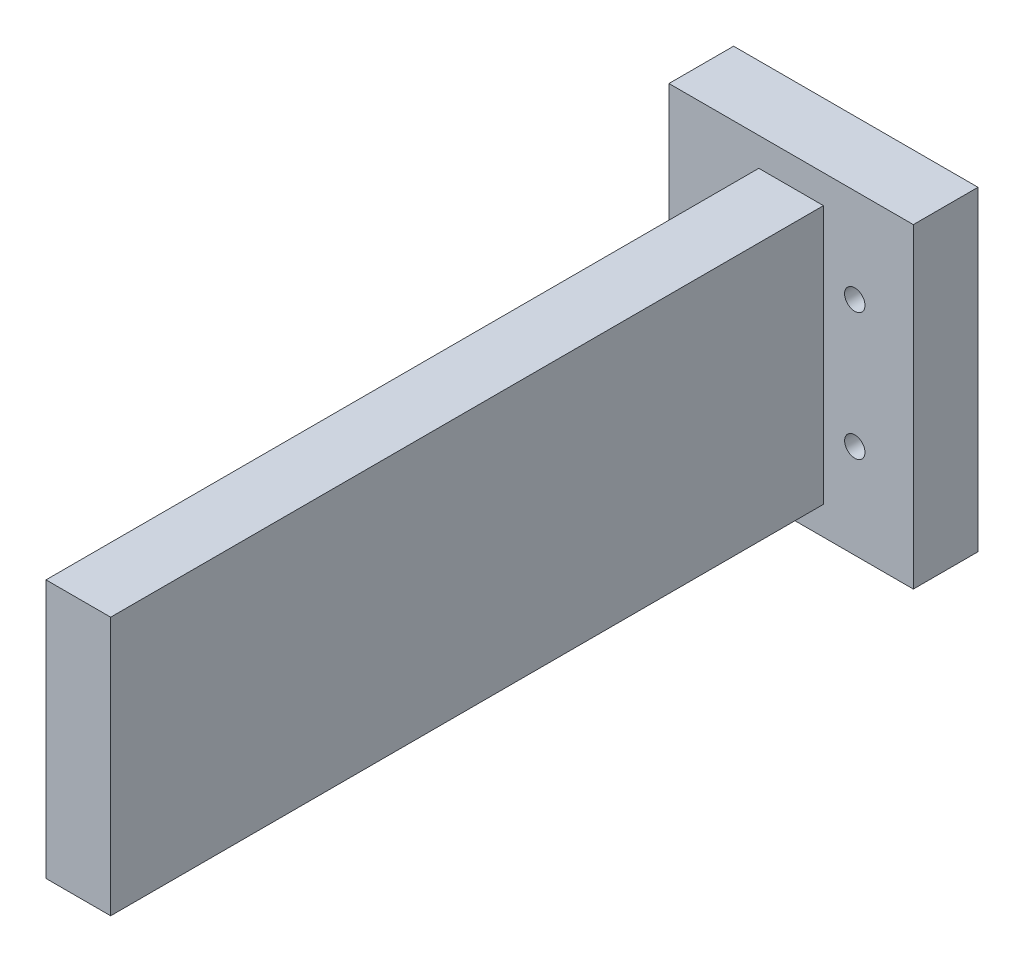
ISO-10303-21;
HEADER;
FILE_DESCRIPTION(('STEP AP214'),'2;1');
FILE_NAME('part.step','',(''),(''),'','','');
FILE_SCHEMA(('AUTOMOTIVE_DESIGN { 1 0 10303 214 1 1 1 1 }'));
ENDSEC;
DATA;
#1=APPLICATION_CONTEXT('core data for automotive mechanical design processes');
#2=APPLICATION_PROTOCOL_DEFINITION('international standard','automotive_design',2000,#1);
#3=PRODUCT_CONTEXT('',#1,'mechanical');
#4=PRODUCT('Part','Part','',(#3));
#5=PRODUCT_RELATED_PRODUCT_CATEGORY('part','',(#4));
#6=PRODUCT_DEFINITION_FORMATION('','',#4);
#7=PRODUCT_DEFINITION_CONTEXT('part definition',#1,'design');
#8=PRODUCT_DEFINITION('design','',#6,#7);
#9=PRODUCT_DEFINITION_SHAPE('','',#8);
#10=(LENGTH_UNIT() NAMED_UNIT(*) SI_UNIT(.MILLI.,.METRE.));
#11=(NAMED_UNIT(*) PLANE_ANGLE_UNIT() SI_UNIT($,.RADIAN.));
#12=(NAMED_UNIT(*) SI_UNIT($,.STERADIAN.) SOLID_ANGLE_UNIT());
#13=UNCERTAINTY_MEASURE_WITH_UNIT(LENGTH_MEASURE(1.E-05),#10,'distance_accuracy_value','');
#14=(GEOMETRIC_REPRESENTATION_CONTEXT(3) GLOBAL_UNCERTAINTY_ASSIGNED_CONTEXT((#13)) GLOBAL_UNIT_ASSIGNED_CONTEXT((#10,
#11,#12)) REPRESENTATION_CONTEXT('',''));
#15=CARTESIAN_POINT('',(0.,0.,0.));
#16=DIRECTION('',(0.,0.,1.));
#17=DIRECTION('',(1.,0.,0.));
#18=AXIS2_PLACEMENT_3D('',#15,#16,#17);
#19=CARTESIAN_POINT('',(0.,0.,12.7));
#20=DIRECTION('',(0.,0.,1.));
#21=DIRECTION('',(1.,0.,0.));
#22=AXIS2_PLACEMENT_3D('',#19,#20,#21);
#23=PLANE('',#22);
#24=CARTESIAN_POINT('',(-12.5,-12.5,12.7));
#25=DIRECTION('',(0.,0.,1.));
#26=DIRECTION('',(1.,0.,0.));
#27=AXIS2_PLACEMENT_3D('',#24,#25,#26);
#28=CIRCLE('',#27,2.01011648454401);
#29=CARTESIAN_POINT('',(-10.489883515456,-12.5,12.7));
#30=VERTEX_POINT('',#29);
#31=EDGE_CURVE('E143',#30,#30,#28,.T.);
#32=ORIENTED_EDGE('',*,*,#31,.F.);
#33=EDGE_LOOP('',(#32));
#34=FACE_BOUND('',#33,.T.);
#35=CARTESIAN_POINT('',(-12.5,12.5,12.7));
#36=DIRECTION('',(0.,0.,1.));
#37=DIRECTION('',(1.,0.,0.));
#38=AXIS2_PLACEMENT_3D('',#35,#36,#37);
#39=CIRCLE('',#38,1.99696048457677);
#40=CARTESIAN_POINT('',(-10.5030395154232,12.5,12.7));
#41=VERTEX_POINT('',#40);
#42=EDGE_CURVE('E155',#41,#41,#39,.T.);
#43=ORIENTED_EDGE('',*,*,#42,.F.);
#44=EDGE_LOOP('',(#43));
#45=FACE_BOUND('',#44,.T.);
#46=DIRECTION('',(0.,-1.,0.));
#47=VECTOR('',#46,1.);
#48=CARTESIAN_POINT('',(-24.,-31.,12.7));
#49=LINE('',#48,#47);
#50=CARTESIAN_POINT('',(-24.,31.,12.7));
#51=VERTEX_POINT('',#50);
#52=CARTESIAN_POINT('',(-24.,-31.,12.7));
#53=VERTEX_POINT('',#52);
#54=EDGE_CURVE('E161',#51,#53,#49,.T.);
#55=ORIENTED_EDGE('',*,*,#54,.T.);
#56=DIRECTION('',(1.,0.,0.));
#57=VECTOR('',#56,1.);
#58=CARTESIAN_POINT('',(24.,-31.,12.7));
#59=LINE('',#58,#57);
#60=CARTESIAN_POINT('',(24.,-31.,12.7));
#61=VERTEX_POINT('',#60);
#62=EDGE_CURVE('E85',#53,#61,#59,.T.);
#63=ORIENTED_EDGE('',*,*,#62,.T.);
#64=DIRECTION('',(0.,1.,0.));
#65=VECTOR('',#64,1.);
#66=CARTESIAN_POINT('',(24.,-31.,12.7));
#67=LINE('',#66,#65);
#68=CARTESIAN_POINT('',(24.,31.,12.7));
#69=VERTEX_POINT('',#68);
#70=EDGE_CURVE('E164',#61,#69,#67,.T.);
#71=ORIENTED_EDGE('',*,*,#70,.T.);
#72=DIRECTION('',(-1.,0.,0.));
#73=VECTOR('',#72,1.);
#74=CARTESIAN_POINT('',(24.,31.,12.7));
#75=LINE('',#74,#73);
#76=EDGE_CURVE('E57',#69,#51,#75,.T.);
#77=ORIENTED_EDGE('',*,*,#76,.T.);
#78=EDGE_LOOP('',(#55,#63,#71,#77));
#79=FACE_BOUND('',#78,.T.);
#80=CARTESIAN_POINT('',(12.5,12.5,12.7));
#81=DIRECTION('',(0.,0.,1.));
#82=DIRECTION('',(1.,0.,0.));
#83=AXIS2_PLACEMENT_3D('',#80,#81,#82);
#84=CIRCLE('',#83,2.00300446249013);
#85=CARTESIAN_POINT('',(14.5030044624901,12.5,12.7));
#86=VERTEX_POINT('',#85);
#87=EDGE_CURVE('E149',#86,#86,#84,.T.);
#88=ORIENTED_EDGE('',*,*,#87,.F.);
#89=EDGE_LOOP('',(#88));
#90=FACE_BOUND('',#89,.T.);
#91=CARTESIAN_POINT('',(12.5,-12.5,12.7));
#92=DIRECTION('',(0.,0.,1.));
#93=DIRECTION('',(1.,0.,0.));
#94=AXIS2_PLACEMENT_3D('',#91,#92,#93);
#95=CIRCLE('',#94,1.99512323308478);
#96=CARTESIAN_POINT('',(14.4951232330848,-12.5,12.7));
#97=VERTEX_POINT('',#96);
#98=EDGE_CURVE('E135',#97,#97,#95,.T.);
#99=ORIENTED_EDGE('',*,*,#98,.F.);
#100=EDGE_LOOP('',(#99));
#101=FACE_BOUND('',#100,.T.);
#102=DIRECTION('',(1.,0.,0.));
#103=VECTOR('',#102,1.);
#104=CARTESIAN_POINT('',(6.35,-25.4,12.7));
#105=LINE('',#104,#103);
#106=CARTESIAN_POINT('',(-6.35,-25.4,12.7));
#107=VERTEX_POINT('',#106);
#108=CARTESIAN_POINT('',(6.35,-25.4,12.7));
#109=VERTEX_POINT('',#108);
#110=EDGE_CURVE('E331',#107,#109,#105,.T.);
#111=ORIENTED_EDGE('',*,*,#110,.F.);
#112=DIRECTION('',(0.,-1.,0.));
#113=VECTOR('',#112,1.);
#114=CARTESIAN_POINT('',(-6.35,-25.4,12.7));
#115=LINE('',#114,#113);
#116=CARTESIAN_POINT('',(-6.35,25.4,12.7));
#117=VERTEX_POINT('',#116);
#118=EDGE_CURVE('E130',#117,#107,#115,.T.);
#119=ORIENTED_EDGE('',*,*,#118,.F.);
#120=DIRECTION('',(-1.,0.,0.));
#121=VECTOR('',#120,1.);
#122=CARTESIAN_POINT('',(6.35,25.4,12.7));
#123=LINE('',#122,#121);
#124=CARTESIAN_POINT('',(6.35,25.4,12.7));
#125=VERTEX_POINT('',#124);
#126=EDGE_CURVE('E126',#125,#117,#123,.T.);
#127=ORIENTED_EDGE('',*,*,#126,.F.);
#128=DIRECTION('',(0.,1.,0.));
#129=VECTOR('',#128,1.);
#130=CARTESIAN_POINT('',(6.35,-25.4,12.7));
#131=LINE('',#130,#129);
#132=EDGE_CURVE('E328',#109,#125,#131,.T.);
#133=ORIENTED_EDGE('',*,*,#132,.F.);
#134=EDGE_LOOP('',(#111,#119,#127,#133));
#135=FACE_BOUND('',#134,.T.);
#136=ADVANCED_FACE('F33',(#34,#45,#79,#90,#101,#135),#23,.T.);
#137=CARTESIAN_POINT('',(0.,0.,0.));
#138=DIRECTION('',(0.,0.,1.));
#139=DIRECTION('',(1.,0.,0.));
#140=AXIS2_PLACEMENT_3D('',#137,#138,#139);
#141=PLANE('',#140);
#142=DIRECTION('',(0.,-1.,0.));
#143=VECTOR('',#142,1.);
#144=CARTESIAN_POINT('',(-24.,-31.,0.));
#145=LINE('',#144,#143);
#146=CARTESIAN_POINT('',(-24.,31.,0.));
#147=VERTEX_POINT('',#146);
#148=CARTESIAN_POINT('',(-24.,-31.,0.));
#149=VERTEX_POINT('',#148);
#150=EDGE_CURVE('E158',#147,#149,#145,.T.);
#151=ORIENTED_EDGE('',*,*,#150,.F.);
#152=DIRECTION('',(-1.,0.,0.));
#153=VECTOR('',#152,1.);
#154=CARTESIAN_POINT('',(24.,31.,0.));
#155=LINE('',#154,#153);
#156=CARTESIAN_POINT('',(24.,31.,0.));
#157=VERTEX_POINT('',#156);
#158=EDGE_CURVE('E78',#157,#147,#155,.T.);
#159=ORIENTED_EDGE('',*,*,#158,.F.);
#160=DIRECTION('',(0.,1.,0.));
#161=VECTOR('',#160,1.);
#162=CARTESIAN_POINT('',(24.,-31.,0.));
#163=LINE('',#162,#161);
#164=CARTESIAN_POINT('',(24.,-31.,0.));
#165=VERTEX_POINT('',#164);
#166=EDGE_CURVE('E172',#165,#157,#163,.T.);
#167=ORIENTED_EDGE('',*,*,#166,.F.);
#168=DIRECTION('',(1.,0.,0.));
#169=VECTOR('',#168,1.);
#170=CARTESIAN_POINT('',(24.,-31.,0.));
#171=LINE('',#170,#169);
#172=EDGE_CURVE('E170',#149,#165,#171,.T.);
#173=ORIENTED_EDGE('',*,*,#172,.F.);
#174=EDGE_LOOP('',(#151,#159,#167,#173));
#175=FACE_BOUND('',#174,.T.);
#176=CARTESIAN_POINT('',(-12.5,12.5,0.));
#177=DIRECTION('',(0.,0.,1.));
#178=DIRECTION('',(1.,0.,0.));
#179=AXIS2_PLACEMENT_3D('',#176,#177,#178);
#180=CIRCLE('',#179,1.99696048457677);
#181=CARTESIAN_POINT('',(-10.5030395154232,12.5,0.));
#182=VERTEX_POINT('',#181);
#183=EDGE_CURVE('E152',#182,#182,#180,.T.);
#184=ORIENTED_EDGE('',*,*,#183,.T.);
#185=EDGE_LOOP('',(#184));
#186=FACE_BOUND('',#185,.T.);
#187=CARTESIAN_POINT('',(12.5,12.5,0.));
#188=DIRECTION('',(0.,0.,1.));
#189=DIRECTION('',(1.,0.,0.));
#190=AXIS2_PLACEMENT_3D('',#187,#188,#189);
#191=CIRCLE('',#190,2.00300446249013);
#192=CARTESIAN_POINT('',(14.5030044624901,12.5,0.));
#193=VERTEX_POINT('',#192);
#194=EDGE_CURVE('E146',#193,#193,#191,.T.);
#195=ORIENTED_EDGE('',*,*,#194,.T.);
#196=EDGE_LOOP('',(#195));
#197=FACE_BOUND('',#196,.T.);
#198=CARTESIAN_POINT('',(-12.5,-12.5,0.));
#199=DIRECTION('',(0.,0.,1.));
#200=DIRECTION('',(1.,0.,0.));
#201=AXIS2_PLACEMENT_3D('',#198,#199,#200);
#202=CIRCLE('',#201,2.01011648454401);
#203=CARTESIAN_POINT('',(-10.489883515456,-12.5,0.));
#204=VERTEX_POINT('',#203);
#205=EDGE_CURVE('E141',#204,#204,#202,.T.);
#206=ORIENTED_EDGE('',*,*,#205,.T.);
#207=EDGE_LOOP('',(#206));
#208=FACE_BOUND('',#207,.T.);
#209=CARTESIAN_POINT('',(12.5,-12.5,0.));
#210=DIRECTION('',(0.,0.,1.));
#211=DIRECTION('',(1.,0.,0.));
#212=AXIS2_PLACEMENT_3D('',#209,#210,#211);
#213=CIRCLE('',#212,1.99512323308478);
#214=CARTESIAN_POINT('',(14.4951232330848,-12.5,0.));
#215=VERTEX_POINT('',#214);
#216=EDGE_CURVE('E132',#215,#215,#213,.T.);
#217=ORIENTED_EDGE('',*,*,#216,.T.);
#218=EDGE_LOOP('',(#217));
#219=FACE_BOUND('',#218,.T.);
#220=ADVANCED_FACE('F185',(#175,#186,#197,#208,#219),#141,.F.);
#221=CARTESIAN_POINT('',(-24.,-31.,12.7));
#222=DIRECTION('',(1.,0.,0.));
#223=DIRECTION('',(0.,0.,-1.));
#224=AXIS2_PLACEMENT_3D('',#221,#222,#223);
#225=PLANE('',#224);
#226=ORIENTED_EDGE('',*,*,#150,.T.);
#227=DIRECTION('',(0.,0.,-1.));
#228=VECTOR('',#227,1.);
#229=CARTESIAN_POINT('',(-24.,-31.,12.7));
#230=LINE('',#229,#228);
#231=EDGE_CURVE('E11',#53,#149,#230,.T.);
#232=ORIENTED_EDGE('',*,*,#231,.F.);
#233=ORIENTED_EDGE('',*,*,#54,.F.);
#234=DIRECTION('',(0.,0.,-1.));
#235=VECTOR('',#234,1.);
#236=CARTESIAN_POINT('',(-24.,31.,12.7));
#237=LINE('',#236,#235);
#238=EDGE_CURVE('E167',#51,#147,#237,.T.);
#239=ORIENTED_EDGE('',*,*,#238,.T.);
#240=EDGE_LOOP('',(#226,#232,#233,#239));
#241=FACE_BOUND('',#240,.T.);
#242=ADVANCED_FACE('F35',(#241),#225,.F.);
#243=CARTESIAN_POINT('',(24.,-31.,12.7));
#244=DIRECTION('',(0.,1.,0.));
#245=DIRECTION('',(-1.,0.,0.));
#246=AXIS2_PLACEMENT_3D('',#243,#244,#245);
#247=PLANE('',#246);
#248=ORIENTED_EDGE('',*,*,#172,.T.);
#249=DIRECTION('',(0.,0.,-1.));
#250=VECTOR('',#249,1.);
#251=CARTESIAN_POINT('',(24.,-31.,12.7));
#252=LINE('',#251,#250);
#253=EDGE_CURVE('E41',#61,#165,#252,.T.);
#254=ORIENTED_EDGE('',*,*,#253,.F.);
#255=ORIENTED_EDGE('',*,*,#62,.F.);
#256=ORIENTED_EDGE('',*,*,#231,.T.);
#257=EDGE_LOOP('',(#248,#254,#255,#256));
#258=FACE_BOUND('',#257,.T.);
#259=ADVANCED_FACE('F201',(#258),#247,.F.);
#260=CARTESIAN_POINT('',(24.,-31.,12.7));
#261=DIRECTION('',(-1.,0.,0.));
#262=DIRECTION('',(0.,0.,1.));
#263=AXIS2_PLACEMENT_3D('',#260,#261,#262);
#264=PLANE('',#263);
#265=ORIENTED_EDGE('',*,*,#166,.T.);
#266=DIRECTION('',(0.,0.,-1.));
#267=VECTOR('',#266,1.);
#268=CARTESIAN_POINT('',(24.,31.,12.7));
#269=LINE('',#268,#267);
#270=EDGE_CURVE('E176',#69,#157,#269,.T.);
#271=ORIENTED_EDGE('',*,*,#270,.F.);
#272=ORIENTED_EDGE('',*,*,#70,.F.);
#273=ORIENTED_EDGE('',*,*,#253,.T.);
#274=EDGE_LOOP('',(#265,#271,#272,#273));
#275=FACE_BOUND('',#274,.T.);
#276=ADVANCED_FACE('F181',(#275),#264,.F.);
#277=CARTESIAN_POINT('',(24.,31.,12.7));
#278=DIRECTION('',(0.,-1.,0.));
#279=DIRECTION('',(1.,0.,0.));
#280=AXIS2_PLACEMENT_3D('',#277,#278,#279);
#281=PLANE('',#280);
#282=ORIENTED_EDGE('',*,*,#158,.T.);
#283=ORIENTED_EDGE('',*,*,#238,.F.);
#284=ORIENTED_EDGE('',*,*,#76,.F.);
#285=ORIENTED_EDGE('',*,*,#270,.T.);
#286=EDGE_LOOP('',(#282,#283,#284,#285));
#287=FACE_BOUND('',#286,.T.);
#288=ADVANCED_FACE('F190',(#287),#281,.F.);
#289=CARTESIAN_POINT('',(-12.5,12.5,12.7));
#290=DIRECTION('',(0.,0.,-1.));
#291=DIRECTION('',(-1.,0.,0.));
#292=AXIS2_PLACEMENT_3D('',#289,#290,#291);
#293=CYLINDRICAL_SURFACE('',#292,1.99696048457677);
#294=ORIENTED_EDGE('',*,*,#42,.T.);
#295=EDGE_LOOP('',(#294));
#296=FACE_BOUND('',#295,.T.);
#297=ORIENTED_EDGE('',*,*,#183,.F.);
#298=EDGE_LOOP('',(#297));
#299=FACE_BOUND('',#298,.T.);
#300=ADVANCED_FACE('F192',(#296,#299),#293,.F.);
#301=CARTESIAN_POINT('',(12.5,12.5,12.7));
#302=DIRECTION('',(0.,0.,-1.));
#303=DIRECTION('',(-1.,0.,0.));
#304=AXIS2_PLACEMENT_3D('',#301,#302,#303);
#305=CYLINDRICAL_SURFACE('',#304,2.00300446249013);
#306=ORIENTED_EDGE('',*,*,#87,.T.);
#307=EDGE_LOOP('',(#306));
#308=FACE_BOUND('',#307,.T.);
#309=ORIENTED_EDGE('',*,*,#194,.F.);
#310=EDGE_LOOP('',(#309));
#311=FACE_BOUND('',#310,.T.);
#312=ADVANCED_FACE('F198',(#308,#311),#305,.F.);
#313=CARTESIAN_POINT('',(-12.5,-12.5,12.7));
#314=DIRECTION('',(0.,0.,-1.));
#315=DIRECTION('',(-1.,0.,0.));
#316=AXIS2_PLACEMENT_3D('',#313,#314,#315);
#317=CYLINDRICAL_SURFACE('',#316,2.01011648454401);
#318=ORIENTED_EDGE('',*,*,#31,.T.);
#319=EDGE_LOOP('',(#318));
#320=FACE_BOUND('',#319,.T.);
#321=ORIENTED_EDGE('',*,*,#205,.F.);
#322=EDGE_LOOP('',(#321));
#323=FACE_BOUND('',#322,.T.);
#324=ADVANCED_FACE('F215',(#320,#323),#317,.F.);
#325=CARTESIAN_POINT('',(12.5,-12.5,12.7));
#326=DIRECTION('',(0.,0.,-1.));
#327=DIRECTION('',(-1.,0.,0.));
#328=AXIS2_PLACEMENT_3D('',#325,#326,#327);
#329=CYLINDRICAL_SURFACE('',#328,1.99512323308478);
#330=ORIENTED_EDGE('',*,*,#98,.T.);
#331=EDGE_LOOP('',(#330));
#332=FACE_BOUND('',#331,.T.);
#333=ORIENTED_EDGE('',*,*,#216,.F.);
#334=EDGE_LOOP('',(#333));
#335=FACE_BOUND('',#334,.T.);
#336=ADVANCED_FACE('F219',(#332,#335),#329,.F.);
#337=CARTESIAN_POINT('',(-6.35,-25.4,152.7));
#338=DIRECTION('',(1.,0.,0.));
#339=DIRECTION('',(0.,0.,-1.));
#340=AXIS2_PLACEMENT_3D('',#337,#338,#339);
#341=PLANE('',#340);
#342=ORIENTED_EDGE('',*,*,#118,.T.);
#343=DIRECTION('',(0.,0.,-1.));
#344=VECTOR('',#343,1.);
#345=CARTESIAN_POINT('',(-6.35,-25.4,152.7));
#346=LINE('',#345,#344);
#347=CARTESIAN_POINT('',(-6.35,-25.4,152.7));
#348=VERTEX_POINT('',#347);
#349=EDGE_CURVE('E111',#348,#107,#346,.T.);
#350=ORIENTED_EDGE('',*,*,#349,.F.);
#351=DIRECTION('',(0.,-1.,0.));
#352=VECTOR('',#351,1.);
#353=CARTESIAN_POINT('',(-6.35,-25.4,152.7));
#354=LINE('',#353,#352);
#355=CARTESIAN_POINT('',(-6.35,25.4,152.7));
#356=VERTEX_POINT('',#355);
#357=EDGE_CURVE('E118',#356,#348,#354,.T.);
#358=ORIENTED_EDGE('',*,*,#357,.F.);
#359=DIRECTION('',(0.,0.,-1.));
#360=VECTOR('',#359,1.);
#361=CARTESIAN_POINT('',(-6.35,25.4,152.7));
#362=LINE('',#361,#360);
#363=EDGE_CURVE('E325',#356,#117,#362,.T.);
#364=ORIENTED_EDGE('',*,*,#363,.T.);
#365=EDGE_LOOP('',(#342,#350,#358,#364));
#366=FACE_BOUND('',#365,.T.);
#367=ADVANCED_FACE('F128',(#366),#341,.F.);
#368=CARTESIAN_POINT('',(6.35,-25.4,152.7));
#369=DIRECTION('',(0.,1.,0.));
#370=DIRECTION('',(0.,0.,1.));
#371=AXIS2_PLACEMENT_3D('',#368,#369,#370);
#372=PLANE('',#371);
#373=ORIENTED_EDGE('',*,*,#110,.T.);
#374=DIRECTION('',(0.,0.,-1.));
#375=VECTOR('',#374,1.);
#376=CARTESIAN_POINT('',(6.35,-25.4,152.7));
#377=LINE('',#376,#375);
#378=CARTESIAN_POINT('',(6.35,-25.4,152.7));
#379=VERTEX_POINT('',#378);
#380=EDGE_CURVE('E114',#379,#109,#377,.T.);
#381=ORIENTED_EDGE('',*,*,#380,.F.);
#382=DIRECTION('',(1.,0.,0.));
#383=VECTOR('',#382,1.);
#384=CARTESIAN_POINT('',(6.35,-25.4,152.7));
#385=LINE('',#384,#383);
#386=EDGE_CURVE('E107',#348,#379,#385,.T.);
#387=ORIENTED_EDGE('',*,*,#386,.F.);
#388=ORIENTED_EDGE('',*,*,#349,.T.);
#389=EDGE_LOOP('',(#373,#381,#387,#388));
#390=FACE_BOUND('',#389,.T.);
#391=ADVANCED_FACE('F109',(#390),#372,.F.);
#392=CARTESIAN_POINT('',(6.35,-25.4,152.7));
#393=DIRECTION('',(-1.,0.,0.));
#394=DIRECTION('',(0.,0.,1.));
#395=AXIS2_PLACEMENT_3D('',#392,#393,#394);
#396=PLANE('',#395);
#397=ORIENTED_EDGE('',*,*,#132,.T.);
#398=DIRECTION('',(0.,0.,-1.));
#399=VECTOR('',#398,1.);
#400=CARTESIAN_POINT('',(6.35,25.4,152.7));
#401=LINE('',#400,#399);
#402=CARTESIAN_POINT('',(6.35,25.4,152.7));
#403=VERTEX_POINT('',#402);
#404=EDGE_CURVE('E48',#403,#125,#401,.T.);
#405=ORIENTED_EDGE('',*,*,#404,.F.);
#406=DIRECTION('',(0.,1.,0.));
#407=VECTOR('',#406,1.);
#408=CARTESIAN_POINT('',(6.35,-25.4,152.7));
#409=LINE('',#408,#407);
#410=EDGE_CURVE('E117',#379,#403,#409,.T.);
#411=ORIENTED_EDGE('',*,*,#410,.F.);
#412=ORIENTED_EDGE('',*,*,#380,.T.);
#413=EDGE_LOOP('',(#397,#405,#411,#412));
#414=FACE_BOUND('',#413,.T.);
#415=ADVANCED_FACE('F228',(#414),#396,.F.);
#416=CARTESIAN_POINT('',(6.35,25.4,152.7));
#417=DIRECTION('',(0.,-1.,0.));
#418=DIRECTION('',(0.,0.,-1.));
#419=AXIS2_PLACEMENT_3D('',#416,#417,#418);
#420=PLANE('',#419);
#421=ORIENTED_EDGE('',*,*,#126,.T.);
#422=ORIENTED_EDGE('',*,*,#363,.F.);
#423=DIRECTION('',(-1.,0.,0.));
#424=VECTOR('',#423,1.);
#425=CARTESIAN_POINT('',(6.35,25.4,152.7));
#426=LINE('',#425,#424);
#427=EDGE_CURVE('E122',#403,#356,#426,.T.);
#428=ORIENTED_EDGE('',*,*,#427,.F.);
#429=ORIENTED_EDGE('',*,*,#404,.T.);
#430=EDGE_LOOP('',(#421,#422,#428,#429));
#431=FACE_BOUND('',#430,.T.);
#432=ADVANCED_FACE('F231',(#431),#420,.F.);
#433=CARTESIAN_POINT('',(0.,0.,152.7));
#434=DIRECTION('',(0.,0.,1.));
#435=DIRECTION('',(1.,0.,0.));
#436=AXIS2_PLACEMENT_3D('',#433,#434,#435);
#437=PLANE('',#436);
#438=ORIENTED_EDGE('',*,*,#357,.T.);
#439=ORIENTED_EDGE('',*,*,#386,.T.);
#440=ORIENTED_EDGE('',*,*,#410,.T.);
#441=ORIENTED_EDGE('',*,*,#427,.T.);
#442=EDGE_LOOP('',(#438,#439,#440,#441));
#443=FACE_BOUND('',#442,.T.);
#444=ADVANCED_FACE('F121',(#443),#437,.T.);
#445=CLOSED_SHELL('',(#136,#220,#242,#259,#276,#288,#300,#312,#324,#336,#367,#391,#415,#432,#444));
#446=MANIFOLD_SOLID_BREP('B2',#445);
#447=ADVANCED_BREP_SHAPE_REPRESENTATION('',(#18,#446),#14);
#448=SHAPE_DEFINITION_REPRESENTATION(#9,#447);
ENDSEC;
END-ISO-10303-21;
